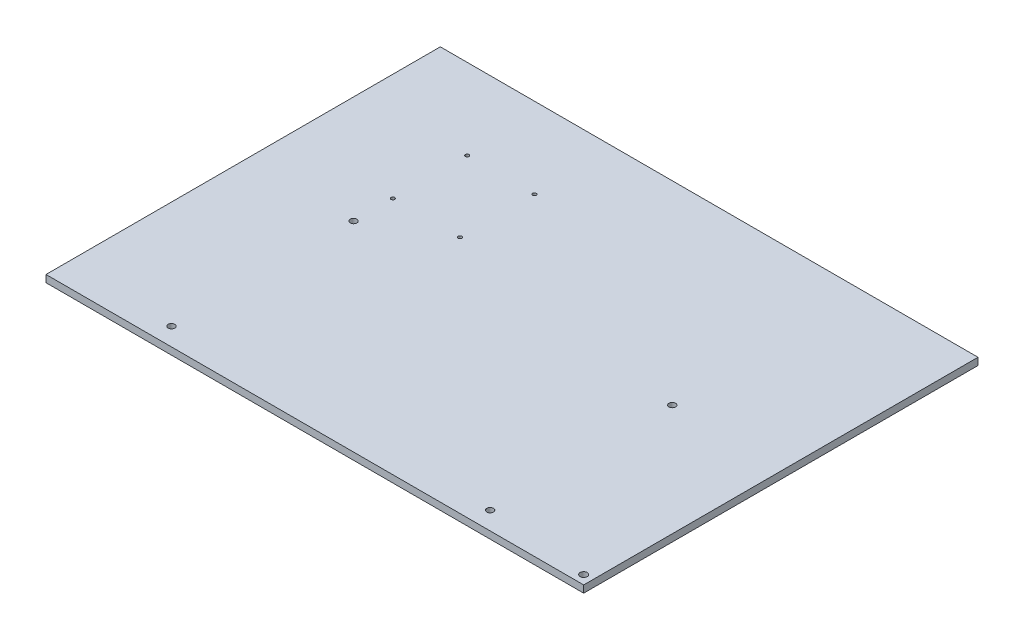
ISO-10303-21;
HEADER;
FILE_DESCRIPTION(('STEP AP214'),'2;1');
FILE_NAME('part.step','',(''),(''),'','','');
FILE_SCHEMA(('AUTOMOTIVE_DESIGN { 1 0 10303 214 1 1 1 1 }'));
ENDSEC;
DATA;
#1=APPLICATION_CONTEXT('core data for automotive mechanical design processes');
#2=APPLICATION_PROTOCOL_DEFINITION('international standard','automotive_design',2000,#1);
#3=PRODUCT_CONTEXT('',#1,'mechanical');
#4=PRODUCT('Part','Part','',(#3));
#5=PRODUCT_RELATED_PRODUCT_CATEGORY('part','',(#4));
#6=PRODUCT_DEFINITION_FORMATION('','',#4);
#7=PRODUCT_DEFINITION_CONTEXT('part definition',#1,'design');
#8=PRODUCT_DEFINITION('design','',#6,#7);
#9=PRODUCT_DEFINITION_SHAPE('','',#8);
#10=(LENGTH_UNIT() NAMED_UNIT(*) SI_UNIT(.MILLI.,.METRE.));
#11=(NAMED_UNIT(*) PLANE_ANGLE_UNIT() SI_UNIT($,.RADIAN.));
#12=(NAMED_UNIT(*) SI_UNIT($,.STERADIAN.) SOLID_ANGLE_UNIT());
#13=UNCERTAINTY_MEASURE_WITH_UNIT(LENGTH_MEASURE(1.E-05),#10,'distance_accuracy_value','');
#14=(GEOMETRIC_REPRESENTATION_CONTEXT(3) GLOBAL_UNCERTAINTY_ASSIGNED_CONTEXT((#13)) GLOBAL_UNIT_ASSIGNED_CONTEXT((#10,
#11,#12)) REPRESENTATION_CONTEXT('',''));
#15=CARTESIAN_POINT('',(0.,0.,0.));
#16=DIRECTION('',(0.,0.,1.));
#17=DIRECTION('',(1.,0.,0.));
#18=AXIS2_PLACEMENT_3D('',#15,#16,#17);
#19=CARTESIAN_POINT('',(-150.,4.,110.));
#20=DIRECTION('',(1.,0.,0.));
#21=DIRECTION('',(0.,0.,-1.));
#22=AXIS2_PLACEMENT_3D('',#19,#20,#21);
#23=PLANE('',#22);
#24=DIRECTION('',(0.,0.,1.));
#25=VECTOR('',#24,1.);
#26=CARTESIAN_POINT('',(-150.,0.,110.));
#27=LINE('',#26,#25);
#28=CARTESIAN_POINT('',(-150.,0.,-110.));
#29=VERTEX_POINT('',#28);
#30=CARTESIAN_POINT('',(-150.,0.,110.));
#31=VERTEX_POINT('',#30);
#32=EDGE_CURVE('E116',#29,#31,#27,.T.);
#33=ORIENTED_EDGE('',*,*,#32,.T.);
#34=DIRECTION('',(0.,-1.,0.));
#35=VECTOR('',#34,1.);
#36=CARTESIAN_POINT('',(-150.,4.,110.));
#37=LINE('',#36,#35);
#38=CARTESIAN_POINT('',(-150.,4.,110.));
#39=VERTEX_POINT('',#38);
#40=EDGE_CURVE('E11',#39,#31,#37,.T.);
#41=ORIENTED_EDGE('',*,*,#40,.F.);
#42=DIRECTION('',(0.,0.,1.));
#43=VECTOR('',#42,1.);
#44=CARTESIAN_POINT('',(-150.,4.,110.));
#45=LINE('',#44,#43);
#46=CARTESIAN_POINT('',(-150.,4.,-110.));
#47=VERTEX_POINT('',#46);
#48=EDGE_CURVE('E99',#47,#39,#45,.T.);
#49=ORIENTED_EDGE('',*,*,#48,.F.);
#50=DIRECTION('',(0.,-1.,0.));
#51=VECTOR('',#50,1.);
#52=CARTESIAN_POINT('',(-150.,4.,-110.));
#53=LINE('',#52,#51);
#54=EDGE_CURVE('E112',#47,#29,#53,.T.);
#55=ORIENTED_EDGE('',*,*,#54,.T.);
#56=EDGE_LOOP('',(#33,#41,#49,#55));
#57=FACE_BOUND('',#56,.T.);
#58=ADVANCED_FACE('F45',(#57),#23,.F.);
#59=CARTESIAN_POINT('',(150.,4.,110.));
#60=DIRECTION('',(0.,0.,-1.));
#61=DIRECTION('',(-1.,0.,0.));
#62=AXIS2_PLACEMENT_3D('',#59,#60,#61);
#63=PLANE('',#62);
#64=DIRECTION('',(1.,0.,0.));
#65=VECTOR('',#64,1.);
#66=CARTESIAN_POINT('',(150.,0.,110.));
#67=LINE('',#66,#65);
#68=CARTESIAN_POINT('',(150.,0.,110.));
#69=VERTEX_POINT('',#68);
#70=EDGE_CURVE('E104',#31,#69,#67,.T.);
#71=ORIENTED_EDGE('',*,*,#70,.T.);
#72=DIRECTION('',(0.,-1.,0.));
#73=VECTOR('',#72,1.);
#74=CARTESIAN_POINT('',(150.,4.,110.));
#75=LINE('',#74,#73);
#76=CARTESIAN_POINT('',(150.,4.,110.));
#77=VERTEX_POINT('',#76);
#78=EDGE_CURVE('E55',#77,#69,#75,.T.);
#79=ORIENTED_EDGE('',*,*,#78,.F.);
#80=DIRECTION('',(1.,0.,0.));
#81=VECTOR('',#80,1.);
#82=CARTESIAN_POINT('',(150.,4.,110.));
#83=LINE('',#82,#81);
#84=EDGE_CURVE('E94',#39,#77,#83,.T.);
#85=ORIENTED_EDGE('',*,*,#84,.F.);
#86=ORIENTED_EDGE('',*,*,#40,.T.);
#87=EDGE_LOOP('',(#71,#79,#85,#86));
#88=FACE_BOUND('',#87,.T.);
#89=ADVANCED_FACE('F103',(#88),#63,.F.);
#90=CARTESIAN_POINT('',(150.,4.,110.));
#91=DIRECTION('',(-1.,0.,0.));
#92=DIRECTION('',(0.,0.,1.));
#93=AXIS2_PLACEMENT_3D('',#90,#91,#92);
#94=PLANE('',#93);
#95=DIRECTION('',(0.,0.,-1.));
#96=VECTOR('',#95,1.);
#97=CARTESIAN_POINT('',(150.,0.,110.));
#98=LINE('',#97,#96);
#99=CARTESIAN_POINT('',(150.,0.,-110.));
#100=VERTEX_POINT('',#99);
#101=EDGE_CURVE('E81',#69,#100,#98,.T.);
#102=ORIENTED_EDGE('',*,*,#101,.T.);
#103=DIRECTION('',(0.,-1.,0.));
#104=VECTOR('',#103,1.);
#105=CARTESIAN_POINT('',(150.,4.,-110.));
#106=LINE('',#105,#104);
#107=CARTESIAN_POINT('',(150.,4.,-110.));
#108=VERTEX_POINT('',#107);
#109=EDGE_CURVE('E106',#108,#100,#106,.T.);
#110=ORIENTED_EDGE('',*,*,#109,.F.);
#111=DIRECTION('',(0.,0.,-1.));
#112=VECTOR('',#111,1.);
#113=CARTESIAN_POINT('',(150.,4.,110.));
#114=LINE('',#113,#112);
#115=EDGE_CURVE('E97',#77,#108,#114,.T.);
#116=ORIENTED_EDGE('',*,*,#115,.F.);
#117=ORIENTED_EDGE('',*,*,#78,.T.);
#118=EDGE_LOOP('',(#102,#110,#116,#117));
#119=FACE_BOUND('',#118,.T.);
#120=ADVANCED_FACE('F108',(#119),#94,.F.);
#121=CARTESIAN_POINT('',(150.,4.,-110.));
#122=DIRECTION('',(0.,0.,1.));
#123=DIRECTION('',(1.,0.,0.));
#124=AXIS2_PLACEMENT_3D('',#121,#122,#123);
#125=PLANE('',#124);
#126=DIRECTION('',(-1.,0.,0.));
#127=VECTOR('',#126,1.);
#128=CARTESIAN_POINT('',(150.,0.,-110.));
#129=LINE('',#128,#127);
#130=EDGE_CURVE('E87',#100,#29,#129,.T.);
#131=ORIENTED_EDGE('',*,*,#130,.T.);
#132=ORIENTED_EDGE('',*,*,#54,.F.);
#133=DIRECTION('',(-1.,0.,0.));
#134=VECTOR('',#133,1.);
#135=CARTESIAN_POINT('',(150.,4.,-110.));
#136=LINE('',#135,#134);
#137=EDGE_CURVE('E64',#108,#47,#136,.T.);
#138=ORIENTED_EDGE('',*,*,#137,.F.);
#139=ORIENTED_EDGE('',*,*,#109,.T.);
#140=EDGE_LOOP('',(#131,#132,#138,#139));
#141=FACE_BOUND('',#140,.T.);
#142=ADVANCED_FACE('F184',(#141),#125,.F.);
#143=CARTESIAN_POINT('',(0.,4.,0.));
#144=DIRECTION('',(0.,1.,0.));
#145=DIRECTION('',(0.,0.,1.));
#146=AXIS2_PLACEMENT_3D('',#143,#144,#145);
#147=PLANE('',#146);
#148=CARTESIAN_POINT('',(145.,4.,105.));
#149=DIRECTION('',(0.,1.,0.));
#150=DIRECTION('',(0.,0.,1.));
#151=AXIS2_PLACEMENT_3D('',#148,#149,#150);
#152=CIRCLE('',#151,2.);
#153=CARTESIAN_POINT('',(145.,4.,107.));
#154=VERTEX_POINT('',#153);
#155=EDGE_CURVE('E278',#154,#154,#152,.T.);
#156=ORIENTED_EDGE('',*,*,#155,.F.);
#157=EDGE_LOOP('',(#156));
#158=FACE_BOUND('',#157,.T.);
#159=CARTESIAN_POINT('',(-89.9999999999999,4.,-23.5));
#160=DIRECTION('',(0.,1.,0.));
#161=DIRECTION('',(0.,0.,1.));
#162=AXIS2_PLACEMENT_3D('',#159,#160,#161);
#163=CIRCLE('',#162,0.999999999999998);
#164=CARTESIAN_POINT('',(-89.9999999999999,4.,-22.5));
#165=VERTEX_POINT('',#164);
#166=EDGE_CURVE('E312',#165,#165,#163,.T.);
#167=ORIENTED_EDGE('',*,*,#166,.F.);
#168=EDGE_LOOP('',(#167));
#169=FACE_BOUND('',#168,.T.);
#170=CARTESIAN_POINT('',(-52.5,4.,-23.5));
#171=DIRECTION('',(0.,1.,0.));
#172=DIRECTION('',(0.,0.,1.));
#173=AXIS2_PLACEMENT_3D('',#170,#171,#172);
#174=CIRCLE('',#173,0.999999999999998);
#175=CARTESIAN_POINT('',(-52.5,4.,-22.5));
#176=VERTEX_POINT('',#175);
#177=EDGE_CURVE('E308',#176,#176,#174,.T.);
#178=ORIENTED_EDGE('',*,*,#177,.F.);
#179=EDGE_LOOP('',(#178));
#180=FACE_BOUND('',#179,.T.);
#181=CARTESIAN_POINT('',(-52.5,4.,-65.));
#182=DIRECTION('',(0.,1.,0.));
#183=DIRECTION('',(0.,0.,1.));
#184=AXIS2_PLACEMENT_3D('',#181,#182,#183);
#185=CIRCLE('',#184,0.999999999999998);
#186=CARTESIAN_POINT('',(-52.5,4.,-64.));
#187=VERTEX_POINT('',#186);
#188=EDGE_CURVE('E304',#187,#187,#185,.T.);
#189=ORIENTED_EDGE('',*,*,#188,.F.);
#190=EDGE_LOOP('',(#189));
#191=FACE_BOUND('',#190,.T.);
#192=CARTESIAN_POINT('',(-90.,4.,-65.));
#193=DIRECTION('',(0.,1.,0.));
#194=DIRECTION('',(0.,0.,1.));
#195=AXIS2_PLACEMENT_3D('',#192,#193,#194);
#196=CIRCLE('',#195,1.00000000000001);
#197=CARTESIAN_POINT('',(-90.,4.,-64.));
#198=VERTEX_POINT('',#197);
#199=EDGE_CURVE('E300',#198,#198,#196,.T.);
#200=ORIENTED_EDGE('',*,*,#199,.F.);
#201=EDGE_LOOP('',(#200));
#202=FACE_BOUND('',#201,.T.);
#203=CARTESIAN_POINT('',(-89.9999999999999,4.,-1.59999999999996));
#204=DIRECTION('',(0.,1.,0.));
#205=DIRECTION('',(0.,0.,-1.));
#206=AXIS2_PLACEMENT_3D('',#203,#204,#205);
#207=CIRCLE('',#206,1.85);
#208=CARTESIAN_POINT('',(-89.9999999999999,4.,0.250000000000042));
#209=VERTEX_POINT('',#208);
#210=EDGE_CURVE('E316',#209,#209,#207,.T.);
#211=ORIENTED_EDGE('',*,*,#210,.F.);
#212=EDGE_LOOP('',(#211));
#213=FACE_BOUND('',#212,.T.);
#214=CARTESIAN_POINT('',(87.8,4.,-1.59999999999996));
#215=DIRECTION('',(0.,1.,0.));
#216=DIRECTION('',(0.,0.,-1.));
#217=AXIS2_PLACEMENT_3D('',#214,#215,#216);
#218=CIRCLE('',#217,1.85);
#219=CARTESIAN_POINT('',(87.8,4.,0.250000000000042));
#220=VERTEX_POINT('',#219);
#221=EDGE_CURVE('E321',#220,#220,#218,.T.);
#222=ORIENTED_EDGE('',*,*,#221,.F.);
#223=EDGE_LOOP('',(#222));
#224=FACE_BOUND('',#223,.T.);
#225=CARTESIAN_POINT('',(87.8000000000001,4.,100.));
#226=DIRECTION('',(0.,1.,0.));
#227=DIRECTION('',(0.,0.,1.));
#228=AXIS2_PLACEMENT_3D('',#225,#226,#227);
#229=CIRCLE('',#228,1.85000000000001);
#230=CARTESIAN_POINT('',(87.8000000000001,4.,101.85));
#231=VERTEX_POINT('',#230);
#232=EDGE_CURVE('E317',#231,#231,#229,.T.);
#233=ORIENTED_EDGE('',*,*,#232,.F.);
#234=EDGE_LOOP('',(#233));
#235=FACE_BOUND('',#234,.T.);
#236=CARTESIAN_POINT('',(-89.9999999999999,4.,100.));
#237=DIRECTION('',(0.,1.,0.));
#238=DIRECTION('',(0.,0.,1.));
#239=AXIS2_PLACEMENT_3D('',#236,#237,#238);
#240=CIRCLE('',#239,1.85000000000001);
#241=CARTESIAN_POINT('',(-89.9999999999999,4.,101.85));
#242=VERTEX_POINT('',#241);
#243=EDGE_CURVE('E135',#242,#242,#240,.T.);
#244=ORIENTED_EDGE('',*,*,#243,.F.);
#245=EDGE_LOOP('',(#244));
#246=FACE_BOUND('',#245,.T.);
#247=ORIENTED_EDGE('',*,*,#48,.T.);
#248=ORIENTED_EDGE('',*,*,#84,.T.);
#249=ORIENTED_EDGE('',*,*,#115,.T.);
#250=ORIENTED_EDGE('',*,*,#137,.T.);
#251=EDGE_LOOP('',(#247,#248,#249,#250));
#252=FACE_BOUND('',#251,.T.);
#253=ADVANCED_FACE('F95',(#158,#169,#180,#191,#202,#213,#224,#235,#246,#252),#147,.T.);
#254=CARTESIAN_POINT('',(0.,0.,0.));
#255=DIRECTION('',(0.,1.,0.));
#256=DIRECTION('',(0.,0.,1.));
#257=AXIS2_PLACEMENT_3D('',#254,#255,#256);
#258=PLANE('',#257);
#259=CARTESIAN_POINT('',(145.,0.,105.));
#260=DIRECTION('',(0.,1.,0.));
#261=DIRECTION('',(0.,0.,1.));
#262=AXIS2_PLACEMENT_3D('',#259,#260,#261);
#263=CIRCLE('',#262,2.);
#264=CARTESIAN_POINT('',(145.,0.,107.));
#265=VERTEX_POINT('',#264);
#266=EDGE_CURVE('E275',#265,#265,#263,.T.);
#267=ORIENTED_EDGE('',*,*,#266,.T.);
#268=EDGE_LOOP('',(#267));
#269=FACE_BOUND('',#268,.T.);
#270=CARTESIAN_POINT('',(-89.9999999999999,0.,-23.5));
#271=DIRECTION('',(0.,1.,0.));
#272=DIRECTION('',(0.,0.,-1.));
#273=AXIS2_PLACEMENT_3D('',#270,#271,#272);
#274=CIRCLE('',#273,0.999999999999998);
#275=CARTESIAN_POINT('',(-89.9999999999999,0.,-24.5));
#276=VERTEX_POINT('',#275);
#277=EDGE_CURVE('E282',#276,#276,#274,.T.);
#278=ORIENTED_EDGE('',*,*,#277,.T.);
#279=EDGE_LOOP('',(#278));
#280=FACE_BOUND('',#279,.T.);
#281=CARTESIAN_POINT('',(-52.5,0.,-23.5));
#282=DIRECTION('',(0.,1.,0.));
#283=DIRECTION('',(0.,0.,1.));
#284=AXIS2_PLACEMENT_3D('',#281,#282,#283);
#285=CIRCLE('',#284,0.999999999999998);
#286=CARTESIAN_POINT('',(-52.5,0.,-22.5));
#287=VERTEX_POINT('',#286);
#288=EDGE_CURVE('E290',#287,#287,#285,.T.);
#289=ORIENTED_EDGE('',*,*,#288,.T.);
#290=EDGE_LOOP('',(#289));
#291=FACE_BOUND('',#290,.T.);
#292=CARTESIAN_POINT('',(-52.5,0.,-65.));
#293=DIRECTION('',(0.,1.,0.));
#294=DIRECTION('',(0.,0.,-1.));
#295=AXIS2_PLACEMENT_3D('',#292,#293,#294);
#296=CIRCLE('',#295,0.999999999999998);
#297=CARTESIAN_POINT('',(-52.5,0.,-66.));
#298=VERTEX_POINT('',#297);
#299=EDGE_CURVE('E285',#298,#298,#296,.T.);
#300=ORIENTED_EDGE('',*,*,#299,.T.);
#301=EDGE_LOOP('',(#300));
#302=FACE_BOUND('',#301,.T.);
#303=CARTESIAN_POINT('',(-90.,0.,-65.));
#304=DIRECTION('',(0.,1.,0.));
#305=DIRECTION('',(0.,0.,1.));
#306=AXIS2_PLACEMENT_3D('',#303,#304,#305);
#307=CIRCLE('',#306,1.00000000000001);
#308=CARTESIAN_POINT('',(-90.,0.,-64.));
#309=VERTEX_POINT('',#308);
#310=EDGE_CURVE('E289',#309,#309,#307,.T.);
#311=ORIENTED_EDGE('',*,*,#310,.T.);
#312=EDGE_LOOP('',(#311));
#313=FACE_BOUND('',#312,.T.);
#314=CARTESIAN_POINT('',(-89.9999999999999,0.,-1.59999999999996));
#315=DIRECTION('',(0.,1.,0.));
#316=DIRECTION('',(0.,0.,1.));
#317=AXIS2_PLACEMENT_3D('',#314,#315,#316);
#318=CIRCLE('',#317,1.85);
#319=CARTESIAN_POINT('',(-89.9999999999999,0.,0.250000000000042));
#320=VERTEX_POINT('',#319);
#321=EDGE_CURVE('E48',#320,#320,#318,.T.);
#322=ORIENTED_EDGE('',*,*,#321,.T.);
#323=EDGE_LOOP('',(#322));
#324=FACE_BOUND('',#323,.T.);
#325=CARTESIAN_POINT('',(87.8,0.,-1.59999999999996));
#326=DIRECTION('',(0.,1.,0.));
#327=DIRECTION('',(0.,0.,1.));
#328=AXIS2_PLACEMENT_3D('',#325,#326,#327);
#329=CIRCLE('',#328,1.85);
#330=CARTESIAN_POINT('',(87.8,0.,0.250000000000042));
#331=VERTEX_POINT('',#330);
#332=EDGE_CURVE('E138',#331,#331,#329,.T.);
#333=ORIENTED_EDGE('',*,*,#332,.T.);
#334=EDGE_LOOP('',(#333));
#335=FACE_BOUND('',#334,.T.);
#336=CARTESIAN_POINT('',(87.8000000000001,0.,100.));
#337=DIRECTION('',(0.,1.,0.));
#338=DIRECTION('',(0.,0.,1.));
#339=AXIS2_PLACEMENT_3D('',#336,#337,#338);
#340=CIRCLE('',#339,1.85000000000001);
#341=CARTESIAN_POINT('',(87.8000000000001,0.,101.85));
#342=VERTEX_POINT('',#341);
#343=EDGE_CURVE('E134',#342,#342,#340,.T.);
#344=ORIENTED_EDGE('',*,*,#343,.T.);
#345=EDGE_LOOP('',(#344));
#346=FACE_BOUND('',#345,.T.);
#347=CARTESIAN_POINT('',(-89.9999999999999,0.,100.));
#348=DIRECTION('',(0.,1.,0.));
#349=DIRECTION('',(0.,0.,1.));
#350=AXIS2_PLACEMENT_3D('',#347,#348,#349);
#351=CIRCLE('',#350,1.85000000000001);
#352=CARTESIAN_POINT('',(-89.9999999999999,0.,101.85));
#353=VERTEX_POINT('',#352);
#354=EDGE_CURVE('E130',#353,#353,#351,.T.);
#355=ORIENTED_EDGE('',*,*,#354,.T.);
#356=EDGE_LOOP('',(#355));
#357=FACE_BOUND('',#356,.T.);
#358=ORIENTED_EDGE('',*,*,#32,.F.);
#359=ORIENTED_EDGE('',*,*,#130,.F.);
#360=ORIENTED_EDGE('',*,*,#101,.F.);
#361=ORIENTED_EDGE('',*,*,#70,.F.);
#362=EDGE_LOOP('',(#358,#359,#360,#361));
#363=FACE_BOUND('',#362,.T.);
#364=ADVANCED_FACE('F147',(#269,#280,#291,#302,#313,#324,#335,#346,#357,#363),#258,.F.);
#365=CARTESIAN_POINT('',(-89.9999999999999,-1.2E-05,100.));
#366=DIRECTION('',(0.,1.,0.));
#367=DIRECTION('',(0.,0.,1.));
#368=AXIS2_PLACEMENT_3D('',#365,#366,#367);
#369=CYLINDRICAL_SURFACE('',#368,1.85000000000001);
#370=CARTESIAN_POINT('',(-89.9999999999999,4.,101.85));
#371=CARTESIAN_POINT('',(-89.9999999999999,3.95833333333333,101.85));
#372=CARTESIAN_POINT('',(-89.9999999999999,3.91666666666667,101.85));
#373=CARTESIAN_POINT('',(-89.9999999999999,3.83333333333333,101.85));
#374=CARTESIAN_POINT('',(-89.9999999999999,3.79166666666667,101.85));
#375=CARTESIAN_POINT('',(-89.9999999999999,3.70833333333333,101.85));
#376=CARTESIAN_POINT('',(-89.9999999999999,3.66666666666667,101.85));
#377=CARTESIAN_POINT('',(-89.9999999999999,3.58333333333333,101.85));
#378=CARTESIAN_POINT('',(-89.9999999999999,3.54166666666667,101.85));
#379=CARTESIAN_POINT('',(-89.9999999999999,3.45833333333333,101.85));
#380=CARTESIAN_POINT('',(-89.9999999999999,3.41666666666667,101.85));
#381=CARTESIAN_POINT('',(-89.9999999999999,3.33333333333333,101.85));
#382=CARTESIAN_POINT('',(-89.9999999999999,3.29166666666667,101.85));
#383=CARTESIAN_POINT('',(-89.9999999999999,3.20833333333333,101.85));
#384=CARTESIAN_POINT('',(-89.9999999999999,3.16666666666667,101.85));
#385=CARTESIAN_POINT('',(-89.9999999999999,3.08333333333333,101.85));
#386=CARTESIAN_POINT('',(-89.9999999999999,3.04166666666667,101.85));
#387=CARTESIAN_POINT('',(-89.9999999999999,2.95833333333333,101.85));
#388=CARTESIAN_POINT('',(-89.9999999999999,2.91666666666667,101.85));
#389=CARTESIAN_POINT('',(-89.9999999999999,2.83333333333333,101.85));
#390=CARTESIAN_POINT('',(-89.9999999999999,2.79166666666667,101.85));
#391=CARTESIAN_POINT('',(-89.9999999999999,2.70833333333333,101.85));
#392=CARTESIAN_POINT('',(-89.9999999999999,2.66666666666667,101.85));
#393=CARTESIAN_POINT('',(-89.9999999999999,2.58333333333333,101.85));
#394=CARTESIAN_POINT('',(-89.9999999999999,2.54166666666667,101.85));
#395=CARTESIAN_POINT('',(-89.9999999999999,2.45833333333333,101.85));
#396=CARTESIAN_POINT('',(-89.9999999999999,2.41666666666667,101.85));
#397=CARTESIAN_POINT('',(-89.9999999999999,2.33333333333333,101.85));
#398=CARTESIAN_POINT('',(-89.9999999999999,2.29166666666667,101.85));
#399=CARTESIAN_POINT('',(-89.9999999999999,2.20833333333333,101.85));
#400=CARTESIAN_POINT('',(-89.9999999999999,2.16666666666667,101.85));
#401=CARTESIAN_POINT('',(-89.9999999999999,2.08333333333333,101.85));
#402=CARTESIAN_POINT('',(-89.9999999999999,2.04166666666667,101.85));
#403=CARTESIAN_POINT('',(-89.9999999999999,1.95833333333333,101.85));
#404=CARTESIAN_POINT('',(-89.9999999999999,1.91666666666667,101.85));
#405=CARTESIAN_POINT('',(-89.9999999999999,1.83333333333333,101.85));
#406=CARTESIAN_POINT('',(-89.9999999999999,1.79166666666667,101.85));
#407=CARTESIAN_POINT('',(-89.9999999999999,1.70833333333333,101.85));
#408=CARTESIAN_POINT('',(-89.9999999999999,1.66666666666667,101.85));
#409=CARTESIAN_POINT('',(-89.9999999999999,1.58333333333333,101.85));
#410=CARTESIAN_POINT('',(-89.9999999999999,1.54166666666667,101.85));
#411=CARTESIAN_POINT('',(-89.9999999999999,1.45833333333333,101.85));
#412=CARTESIAN_POINT('',(-89.9999999999999,1.41666666666667,101.85));
#413=CARTESIAN_POINT('',(-89.9999999999999,1.33333333333333,101.85));
#414=CARTESIAN_POINT('',(-89.9999999999999,1.29166666666667,101.85));
#415=CARTESIAN_POINT('',(-89.9999999999999,1.20833333333333,101.85));
#416=CARTESIAN_POINT('',(-89.9999999999999,1.16666666666667,101.85));
#417=CARTESIAN_POINT('',(-89.9999999999999,1.08333333333333,101.85));
#418=CARTESIAN_POINT('',(-89.9999999999999,1.04166666666667,101.85));
#419=CARTESIAN_POINT('',(-89.9999999999999,0.958333333333333,101.85));
#420=CARTESIAN_POINT('',(-89.9999999999999,0.916666666666667,101.85));
#421=CARTESIAN_POINT('',(-89.9999999999999,0.833333333333333,101.85));
#422=CARTESIAN_POINT('',(-89.9999999999999,0.791666666666667,101.85));
#423=CARTESIAN_POINT('',(-89.9999999999999,0.708333333333333,101.85));
#424=CARTESIAN_POINT('',(-89.9999999999999,0.666666666666667,101.85));
#425=CARTESIAN_POINT('',(-89.9999999999999,0.583333333333333,101.85));
#426=CARTESIAN_POINT('',(-89.9999999999999,0.541666666666666,101.85));
#427=CARTESIAN_POINT('',(-89.9999999999999,0.458333333333333,101.85));
#428=CARTESIAN_POINT('',(-89.9999999999999,0.416666666666666,101.85));
#429=CARTESIAN_POINT('',(-89.9999999999999,0.333333333333333,101.85));
#430=CARTESIAN_POINT('',(-89.9999999999999,0.291666666666666,101.85));
#431=CARTESIAN_POINT('',(-89.9999999999999,0.208333333333333,101.85));
#432=CARTESIAN_POINT('',(-89.9999999999999,0.166666666666667,101.85));
#433=CARTESIAN_POINT('',(-89.9999999999999,0.0833333333333331,101.85));
#434=CARTESIAN_POINT('',(-89.9999999999999,0.0416666666666665,101.85));
#435=CARTESIAN_POINT('',(-89.9999999999999,0.,101.85));
#436=B_SPLINE_CURVE_WITH_KNOTS('',3,(#370,#371,#372,#373,#374,#375,#376,#377,#378,#379,#380,
#381,#382,#383,#384,#385,#386,#387,#388,#389,#390,#391,#392,#393,#394,#395,#396,#397,#398,#399,
#400,#401,#402,#403,#404,#405,#406,#407,#408,#409,#410,#411,#412,#413,#414,#415,#416,#417,#418,
#419,#420,#421,#422,#423,#424,#425,#426,#427,#428,#429,#430,#431,#432,#433,#434,#435),
.UNSPECIFIED.,.F.,.F.,(4,2,2,2,2,2,2,2,2,2,2,2,2,2,2,2,2,2,2,2,2,2,2,2,2,2,2,2,2,2,2,2,4),(0.,
0.125,0.25,0.375,0.5,0.625,0.75,0.875,1.,1.125,1.25,1.375,1.5,1.625,1.75,1.875,2.,2.125,2.25,
2.375,2.5,2.625,2.75,2.875,3.,3.125,3.25,3.375,3.5,3.625,3.75,3.875,4.),.UNSPECIFIED.);
#437=EDGE_CURVE('BSEAM175',#242,#353,#436,.T.);
#438=ORIENTED_EDGE('',*,*,#243,.T.);
#439=ORIENTED_EDGE('',*,*,#354,.F.);
#440=ORIENTED_EDGE('',*,*,#437,.T.);
#441=ORIENTED_EDGE('',*,*,#437,.F.);
#442=EDGE_LOOP('',(#438,#440,#439,#441));
#443=FACE_BOUND('',#442,.T.);
#444=ADVANCED_FACE('F175',(#443),#369,.F.);
#445=CARTESIAN_POINT('',(87.8000000000001,-1.2E-05,100.));
#446=DIRECTION('',(0.,1.,0.));
#447=DIRECTION('',(0.,0.,1.));
#448=AXIS2_PLACEMENT_3D('',#445,#446,#447);
#449=CYLINDRICAL_SURFACE('',#448,1.85000000000001);
#450=CARTESIAN_POINT('',(87.8000000000001,4.,101.85));
#451=CARTESIAN_POINT('',(87.8000000000001,3.95833333333333,101.85));
#452=CARTESIAN_POINT('',(87.8000000000001,3.91666666666667,101.85));
#453=CARTESIAN_POINT('',(87.8000000000001,3.83333333333333,101.85));
#454=CARTESIAN_POINT('',(87.8000000000001,3.79166666666667,101.85));
#455=CARTESIAN_POINT('',(87.8000000000001,3.70833333333333,101.85));
#456=CARTESIAN_POINT('',(87.8000000000001,3.66666666666667,101.85));
#457=CARTESIAN_POINT('',(87.8000000000001,3.58333333333333,101.85));
#458=CARTESIAN_POINT('',(87.8000000000001,3.54166666666667,101.85));
#459=CARTESIAN_POINT('',(87.8000000000001,3.45833333333333,101.85));
#460=CARTESIAN_POINT('',(87.8000000000001,3.41666666666667,101.85));
#461=CARTESIAN_POINT('',(87.8000000000001,3.33333333333333,101.85));
#462=CARTESIAN_POINT('',(87.8000000000001,3.29166666666667,101.85));
#463=CARTESIAN_POINT('',(87.8000000000001,3.20833333333333,101.85));
#464=CARTESIAN_POINT('',(87.8000000000001,3.16666666666667,101.85));
#465=CARTESIAN_POINT('',(87.8000000000001,3.08333333333333,101.85));
#466=CARTESIAN_POINT('',(87.8000000000001,3.04166666666667,101.85));
#467=CARTESIAN_POINT('',(87.8000000000001,2.95833333333333,101.85));
#468=CARTESIAN_POINT('',(87.8000000000001,2.91666666666667,101.85));
#469=CARTESIAN_POINT('',(87.8000000000001,2.83333333333333,101.85));
#470=CARTESIAN_POINT('',(87.8000000000001,2.79166666666667,101.85));
#471=CARTESIAN_POINT('',(87.8000000000001,2.70833333333333,101.85));
#472=CARTESIAN_POINT('',(87.8000000000001,2.66666666666667,101.85));
#473=CARTESIAN_POINT('',(87.8000000000001,2.58333333333333,101.85));
#474=CARTESIAN_POINT('',(87.8000000000001,2.54166666666667,101.85));
#475=CARTESIAN_POINT('',(87.8000000000001,2.45833333333333,101.85));
#476=CARTESIAN_POINT('',(87.8000000000001,2.41666666666667,101.85));
#477=CARTESIAN_POINT('',(87.8000000000001,2.33333333333333,101.85));
#478=CARTESIAN_POINT('',(87.8000000000001,2.29166666666667,101.85));
#479=CARTESIAN_POINT('',(87.8000000000001,2.20833333333333,101.85));
#480=CARTESIAN_POINT('',(87.8000000000001,2.16666666666667,101.85));
#481=CARTESIAN_POINT('',(87.8000000000001,2.08333333333333,101.85));
#482=CARTESIAN_POINT('',(87.8000000000001,2.04166666666667,101.85));
#483=CARTESIAN_POINT('',(87.8000000000001,1.95833333333333,101.85));
#484=CARTESIAN_POINT('',(87.8000000000001,1.91666666666667,101.85));
#485=CARTESIAN_POINT('',(87.8000000000001,1.83333333333333,101.85));
#486=CARTESIAN_POINT('',(87.8000000000001,1.79166666666667,101.85));
#487=CARTESIAN_POINT('',(87.8000000000001,1.70833333333333,101.85));
#488=CARTESIAN_POINT('',(87.8000000000001,1.66666666666667,101.85));
#489=CARTESIAN_POINT('',(87.8000000000001,1.58333333333333,101.85));
#490=CARTESIAN_POINT('',(87.8000000000001,1.54166666666667,101.85));
#491=CARTESIAN_POINT('',(87.8000000000001,1.45833333333333,101.85));
#492=CARTESIAN_POINT('',(87.8000000000001,1.41666666666667,101.85));
#493=CARTESIAN_POINT('',(87.8000000000001,1.33333333333333,101.85));
#494=CARTESIAN_POINT('',(87.8000000000001,1.29166666666667,101.85));
#495=CARTESIAN_POINT('',(87.8000000000001,1.20833333333333,101.85));
#496=CARTESIAN_POINT('',(87.8000000000001,1.16666666666667,101.85));
#497=CARTESIAN_POINT('',(87.8000000000001,1.08333333333333,101.85));
#498=CARTESIAN_POINT('',(87.8000000000001,1.04166666666667,101.85));
#499=CARTESIAN_POINT('',(87.8000000000001,0.958333333333333,101.85));
#500=CARTESIAN_POINT('',(87.8000000000001,0.916666666666667,101.85));
#501=CARTESIAN_POINT('',(87.8000000000001,0.833333333333333,101.85));
#502=CARTESIAN_POINT('',(87.8000000000001,0.791666666666667,101.85));
#503=CARTESIAN_POINT('',(87.8000000000001,0.708333333333333,101.85));
#504=CARTESIAN_POINT('',(87.8000000000001,0.666666666666667,101.85));
#505=CARTESIAN_POINT('',(87.8000000000001,0.583333333333333,101.85));
#506=CARTESIAN_POINT('',(87.8000000000001,0.541666666666666,101.85));
#507=CARTESIAN_POINT('',(87.8000000000001,0.458333333333333,101.85));
#508=CARTESIAN_POINT('',(87.8000000000001,0.416666666666666,101.85));
#509=CARTESIAN_POINT('',(87.8000000000001,0.333333333333333,101.85));
#510=CARTESIAN_POINT('',(87.8000000000001,0.291666666666666,101.85));
#511=CARTESIAN_POINT('',(87.8000000000001,0.208333333333333,101.85));
#512=CARTESIAN_POINT('',(87.8000000000001,0.166666666666667,101.85));
#513=CARTESIAN_POINT('',(87.8000000000001,0.0833333333333331,101.85));
#514=CARTESIAN_POINT('',(87.8000000000001,0.0416666666666665,101.85));
#515=CARTESIAN_POINT('',(87.8000000000001,0.,101.85));
#516=B_SPLINE_CURVE_WITH_KNOTS('',3,(#450,#451,#452,#453,#454,#455,#456,#457,#458,#459,#460,
#461,#462,#463,#464,#465,#466,#467,#468,#469,#470,#471,#472,#473,#474,#475,#476,#477,#478,#479,
#480,#481,#482,#483,#484,#485,#486,#487,#488,#489,#490,#491,#492,#493,#494,#495,#496,#497,#498,
#499,#500,#501,#502,#503,#504,#505,#506,#507,#508,#509,#510,#511,#512,#513,#514,#515),
.UNSPECIFIED.,.F.,.F.,(4,2,2,2,2,2,2,2,2,2,2,2,2,2,2,2,2,2,2,2,2,2,2,2,2,2,2,2,2,2,2,2,4),(0.,
0.125,0.25,0.375,0.5,0.625,0.75,0.875,1.,1.125,1.25,1.375,1.5,1.625,1.75,1.875,2.,2.125,2.25,
2.375,2.5,2.625,2.75,2.875,3.,3.125,3.25,3.375,3.5,3.625,3.75,3.875,4.),.UNSPECIFIED.);
#517=EDGE_CURVE('BSEAM162',#231,#342,#516,.T.);
#518=ORIENTED_EDGE('',*,*,#232,.T.);
#519=ORIENTED_EDGE('',*,*,#343,.F.);
#520=ORIENTED_EDGE('',*,*,#517,.T.);
#521=ORIENTED_EDGE('',*,*,#517,.F.);
#522=EDGE_LOOP('',(#518,#520,#519,#521));
#523=FACE_BOUND('',#522,.T.);
#524=ADVANCED_FACE('F162',(#523),#449,.F.);
#525=CARTESIAN_POINT('',(87.8,-1.2E-05,-1.59999999999996));
#526=DIRECTION('',(0.,1.,0.));
#527=DIRECTION('',(0.,0.,1.));
#528=AXIS2_PLACEMENT_3D('',#525,#526,#527);
#529=CYLINDRICAL_SURFACE('',#528,1.85);
#530=CARTESIAN_POINT('',(87.8,4.,0.250000000000042));
#531=CARTESIAN_POINT('',(87.8,3.95833333333333,0.250000000000042));
#532=CARTESIAN_POINT('',(87.8,3.91666666666667,0.250000000000042));
#533=CARTESIAN_POINT('',(87.8,3.83333333333333,0.250000000000042));
#534=CARTESIAN_POINT('',(87.8,3.79166666666667,0.250000000000042));
#535=CARTESIAN_POINT('',(87.8,3.70833333333333,0.250000000000042));
#536=CARTESIAN_POINT('',(87.8,3.66666666666667,0.250000000000042));
#537=CARTESIAN_POINT('',(87.8,3.58333333333333,0.250000000000042));
#538=CARTESIAN_POINT('',(87.8,3.54166666666667,0.250000000000042));
#539=CARTESIAN_POINT('',(87.8,3.45833333333333,0.250000000000042));
#540=CARTESIAN_POINT('',(87.8,3.41666666666667,0.250000000000042));
#541=CARTESIAN_POINT('',(87.8,3.33333333333333,0.250000000000042));
#542=CARTESIAN_POINT('',(87.8,3.29166666666667,0.250000000000042));
#543=CARTESIAN_POINT('',(87.8,3.20833333333333,0.250000000000042));
#544=CARTESIAN_POINT('',(87.8,3.16666666666667,0.250000000000042));
#545=CARTESIAN_POINT('',(87.8,3.08333333333333,0.250000000000042));
#546=CARTESIAN_POINT('',(87.8,3.04166666666667,0.250000000000042));
#547=CARTESIAN_POINT('',(87.8,2.95833333333333,0.250000000000042));
#548=CARTESIAN_POINT('',(87.8,2.91666666666667,0.250000000000042));
#549=CARTESIAN_POINT('',(87.8,2.83333333333333,0.250000000000042));
#550=CARTESIAN_POINT('',(87.8,2.79166666666667,0.250000000000042));
#551=CARTESIAN_POINT('',(87.8,2.70833333333333,0.250000000000042));
#552=CARTESIAN_POINT('',(87.8,2.66666666666667,0.250000000000042));
#553=CARTESIAN_POINT('',(87.8,2.58333333333333,0.250000000000042));
#554=CARTESIAN_POINT('',(87.8,2.54166666666667,0.250000000000042));
#555=CARTESIAN_POINT('',(87.8,2.45833333333333,0.250000000000042));
#556=CARTESIAN_POINT('',(87.8,2.41666666666667,0.250000000000042));
#557=CARTESIAN_POINT('',(87.8,2.33333333333333,0.250000000000042));
#558=CARTESIAN_POINT('',(87.8,2.29166666666667,0.250000000000042));
#559=CARTESIAN_POINT('',(87.8,2.20833333333333,0.250000000000042));
#560=CARTESIAN_POINT('',(87.8,2.16666666666667,0.250000000000042));
#561=CARTESIAN_POINT('',(87.8,2.08333333333333,0.250000000000042));
#562=CARTESIAN_POINT('',(87.8,2.04166666666667,0.250000000000042));
#563=CARTESIAN_POINT('',(87.8,1.95833333333333,0.250000000000042));
#564=CARTESIAN_POINT('',(87.8,1.91666666666667,0.250000000000042));
#565=CARTESIAN_POINT('',(87.8,1.83333333333333,0.250000000000042));
#566=CARTESIAN_POINT('',(87.8,1.79166666666667,0.250000000000042));
#567=CARTESIAN_POINT('',(87.8,1.70833333333333,0.250000000000042));
#568=CARTESIAN_POINT('',(87.8,1.66666666666667,0.250000000000042));
#569=CARTESIAN_POINT('',(87.8,1.58333333333333,0.250000000000042));
#570=CARTESIAN_POINT('',(87.8,1.54166666666667,0.250000000000042));
#571=CARTESIAN_POINT('',(87.8,1.45833333333333,0.250000000000042));
#572=CARTESIAN_POINT('',(87.8,1.41666666666667,0.250000000000042));
#573=CARTESIAN_POINT('',(87.8,1.33333333333333,0.250000000000042));
#574=CARTESIAN_POINT('',(87.8,1.29166666666667,0.250000000000042));
#575=CARTESIAN_POINT('',(87.8,1.20833333333333,0.250000000000042));
#576=CARTESIAN_POINT('',(87.8,1.16666666666667,0.250000000000042));
#577=CARTESIAN_POINT('',(87.8,1.08333333333333,0.250000000000042));
#578=CARTESIAN_POINT('',(87.8,1.04166666666667,0.250000000000042));
#579=CARTESIAN_POINT('',(87.8,0.958333333333333,0.250000000000042));
#580=CARTESIAN_POINT('',(87.8,0.916666666666667,0.250000000000042));
#581=CARTESIAN_POINT('',(87.8,0.833333333333333,0.250000000000042));
#582=CARTESIAN_POINT('',(87.8,0.791666666666667,0.250000000000042));
#583=CARTESIAN_POINT('',(87.8,0.708333333333333,0.250000000000042));
#584=CARTESIAN_POINT('',(87.8,0.666666666666667,0.250000000000042));
#585=CARTESIAN_POINT('',(87.8,0.583333333333333,0.250000000000042));
#586=CARTESIAN_POINT('',(87.8,0.541666666666666,0.250000000000042));
#587=CARTESIAN_POINT('',(87.8,0.458333333333333,0.250000000000042));
#588=CARTESIAN_POINT('',(87.8,0.416666666666666,0.250000000000042));
#589=CARTESIAN_POINT('',(87.8,0.333333333333333,0.250000000000042));
#590=CARTESIAN_POINT('',(87.8,0.291666666666666,0.250000000000042));
#591=CARTESIAN_POINT('',(87.8,0.208333333333333,0.250000000000042));
#592=CARTESIAN_POINT('',(87.8,0.166666666666667,0.250000000000042));
#593=CARTESIAN_POINT('',(87.8,0.0833333333333331,0.250000000000042));
#594=CARTESIAN_POINT('',(87.8,0.0416666666666665,0.250000000000042));
#595=CARTESIAN_POINT('',(87.8,0.,0.250000000000042));
#596=B_SPLINE_CURVE_WITH_KNOTS('',3,(#530,#531,#532,#533,#534,#535,#536,#537,#538,#539,#540,
#541,#542,#543,#544,#545,#546,#547,#548,#549,#550,#551,#552,#553,#554,#555,#556,#557,#558,#559,
#560,#561,#562,#563,#564,#565,#566,#567,#568,#569,#570,#571,#572,#573,#574,#575,#576,#577,#578,
#579,#580,#581,#582,#583,#584,#585,#586,#587,#588,#589,#590,#591,#592,#593,#594,#595),
.UNSPECIFIED.,.F.,.F.,(4,2,2,2,2,2,2,2,2,2,2,2,2,2,2,2,2,2,2,2,2,2,2,2,2,2,2,2,2,2,2,2,4),(0.,
0.125,0.25,0.375,0.5,0.625,0.75,0.875,1.,1.125,1.25,1.375,1.5,1.625,1.75,1.875,2.,2.125,2.25,
2.375,2.5,2.625,2.75,2.875,3.,3.125,3.25,3.375,3.5,3.625,3.75,3.875,4.),.UNSPECIFIED.);
#597=EDGE_CURVE('BSEAM152',#220,#331,#596,.T.);
#598=ORIENTED_EDGE('',*,*,#221,.T.);
#599=ORIENTED_EDGE('',*,*,#332,.F.);
#600=ORIENTED_EDGE('',*,*,#597,.T.);
#601=ORIENTED_EDGE('',*,*,#597,.F.);
#602=EDGE_LOOP('',(#598,#600,#599,#601));
#603=FACE_BOUND('',#602,.T.);
#604=ADVANCED_FACE('F152',(#603),#529,.F.);
#605=CARTESIAN_POINT('',(-89.9999999999999,-1.2E-05,-1.59999999999996));
#606=DIRECTION('',(0.,1.,0.));
#607=DIRECTION('',(0.,0.,1.));
#608=AXIS2_PLACEMENT_3D('',#605,#606,#607);
#609=CYLINDRICAL_SURFACE('',#608,1.85);
#610=CARTESIAN_POINT('',(-89.9999999999999,4.,0.250000000000042));
#611=CARTESIAN_POINT('',(-89.9999999999999,3.95833333333333,0.250000000000042));
#612=CARTESIAN_POINT('',(-89.9999999999999,3.91666666666667,0.250000000000042));
#613=CARTESIAN_POINT('',(-89.9999999999999,3.83333333333333,0.250000000000042));
#614=CARTESIAN_POINT('',(-89.9999999999999,3.79166666666667,0.250000000000042));
#615=CARTESIAN_POINT('',(-89.9999999999999,3.70833333333333,0.250000000000042));
#616=CARTESIAN_POINT('',(-89.9999999999999,3.66666666666667,0.250000000000042));
#617=CARTESIAN_POINT('',(-89.9999999999999,3.58333333333333,0.250000000000042));
#618=CARTESIAN_POINT('',(-89.9999999999999,3.54166666666667,0.250000000000042));
#619=CARTESIAN_POINT('',(-89.9999999999999,3.45833333333333,0.250000000000042));
#620=CARTESIAN_POINT('',(-89.9999999999999,3.41666666666667,0.250000000000042));
#621=CARTESIAN_POINT('',(-89.9999999999999,3.33333333333333,0.250000000000042));
#622=CARTESIAN_POINT('',(-89.9999999999999,3.29166666666667,0.250000000000042));
#623=CARTESIAN_POINT('',(-89.9999999999999,3.20833333333333,0.250000000000042));
#624=CARTESIAN_POINT('',(-89.9999999999999,3.16666666666667,0.250000000000042));
#625=CARTESIAN_POINT('',(-89.9999999999999,3.08333333333333,0.250000000000042));
#626=CARTESIAN_POINT('',(-89.9999999999999,3.04166666666667,0.250000000000042));
#627=CARTESIAN_POINT('',(-89.9999999999999,2.95833333333333,0.250000000000042));
#628=CARTESIAN_POINT('',(-89.9999999999999,2.91666666666667,0.250000000000042));
#629=CARTESIAN_POINT('',(-89.9999999999999,2.83333333333333,0.250000000000042));
#630=CARTESIAN_POINT('',(-89.9999999999999,2.79166666666667,0.250000000000042));
#631=CARTESIAN_POINT('',(-89.9999999999999,2.70833333333333,0.250000000000042));
#632=CARTESIAN_POINT('',(-89.9999999999999,2.66666666666667,0.250000000000042));
#633=CARTESIAN_POINT('',(-89.9999999999999,2.58333333333333,0.250000000000042));
#634=CARTESIAN_POINT('',(-89.9999999999999,2.54166666666667,0.250000000000042));
#635=CARTESIAN_POINT('',(-89.9999999999999,2.45833333333333,0.250000000000042));
#636=CARTESIAN_POINT('',(-89.9999999999999,2.41666666666667,0.250000000000042));
#637=CARTESIAN_POINT('',(-89.9999999999999,2.33333333333333,0.250000000000042));
#638=CARTESIAN_POINT('',(-89.9999999999999,2.29166666666667,0.250000000000042));
#639=CARTESIAN_POINT('',(-89.9999999999999,2.20833333333333,0.250000000000042));
#640=CARTESIAN_POINT('',(-89.9999999999999,2.16666666666667,0.250000000000042));
#641=CARTESIAN_POINT('',(-89.9999999999999,2.08333333333333,0.250000000000042));
#642=CARTESIAN_POINT('',(-89.9999999999999,2.04166666666667,0.250000000000042));
#643=CARTESIAN_POINT('',(-89.9999999999999,1.95833333333333,0.250000000000042));
#644=CARTESIAN_POINT('',(-89.9999999999999,1.91666666666667,0.250000000000042));
#645=CARTESIAN_POINT('',(-89.9999999999999,1.83333333333333,0.250000000000042));
#646=CARTESIAN_POINT('',(-89.9999999999999,1.79166666666667,0.250000000000042));
#647=CARTESIAN_POINT('',(-89.9999999999999,1.70833333333333,0.250000000000042));
#648=CARTESIAN_POINT('',(-89.9999999999999,1.66666666666667,0.250000000000042));
#649=CARTESIAN_POINT('',(-89.9999999999999,1.58333333333333,0.250000000000042));
#650=CARTESIAN_POINT('',(-89.9999999999999,1.54166666666667,0.250000000000042));
#651=CARTESIAN_POINT('',(-89.9999999999999,1.45833333333333,0.250000000000042));
#652=CARTESIAN_POINT('',(-89.9999999999999,1.41666666666667,0.250000000000042));
#653=CARTESIAN_POINT('',(-89.9999999999999,1.33333333333333,0.250000000000042));
#654=CARTESIAN_POINT('',(-89.9999999999999,1.29166666666667,0.250000000000042));
#655=CARTESIAN_POINT('',(-89.9999999999999,1.20833333333333,0.250000000000042));
#656=CARTESIAN_POINT('',(-89.9999999999999,1.16666666666667,0.250000000000042));
#657=CARTESIAN_POINT('',(-89.9999999999999,1.08333333333333,0.250000000000042));
#658=CARTESIAN_POINT('',(-89.9999999999999,1.04166666666667,0.250000000000042));
#659=CARTESIAN_POINT('',(-89.9999999999999,0.958333333333333,0.250000000000042));
#660=CARTESIAN_POINT('',(-89.9999999999999,0.916666666666667,0.250000000000042));
#661=CARTESIAN_POINT('',(-89.9999999999999,0.833333333333333,0.250000000000042));
#662=CARTESIAN_POINT('',(-89.9999999999999,0.791666666666667,0.250000000000042));
#663=CARTESIAN_POINT('',(-89.9999999999999,0.708333333333333,0.250000000000042));
#664=CARTESIAN_POINT('',(-89.9999999999999,0.666666666666667,0.250000000000042));
#665=CARTESIAN_POINT('',(-89.9999999999999,0.583333333333333,0.250000000000042));
#666=CARTESIAN_POINT('',(-89.9999999999999,0.541666666666666,0.250000000000042));
#667=CARTESIAN_POINT('',(-89.9999999999999,0.458333333333333,0.250000000000042));
#668=CARTESIAN_POINT('',(-89.9999999999999,0.416666666666666,0.250000000000042));
#669=CARTESIAN_POINT('',(-89.9999999999999,0.333333333333333,0.250000000000042));
#670=CARTESIAN_POINT('',(-89.9999999999999,0.291666666666666,0.250000000000042));
#671=CARTESIAN_POINT('',(-89.9999999999999,0.208333333333333,0.250000000000042));
#672=CARTESIAN_POINT('',(-89.9999999999999,0.166666666666667,0.250000000000042));
#673=CARTESIAN_POINT('',(-89.9999999999999,0.0833333333333331,0.250000000000042));
#674=CARTESIAN_POINT('',(-89.9999999999999,0.0416666666666665,0.250000000000042));
#675=CARTESIAN_POINT('',(-89.9999999999999,0.,0.250000000000042));
#676=B_SPLINE_CURVE_WITH_KNOTS('',3,(#610,#611,#612,#613,#614,#615,#616,#617,#618,#619,#620,
#621,#622,#623,#624,#625,#626,#627,#628,#629,#630,#631,#632,#633,#634,#635,#636,#637,#638,#639,
#640,#641,#642,#643,#644,#645,#646,#647,#648,#649,#650,#651,#652,#653,#654,#655,#656,#657,#658,
#659,#660,#661,#662,#663,#664,#665,#666,#667,#668,#669,#670,#671,#672,#673,#674,#675),
.UNSPECIFIED.,.F.,.F.,(4,2,2,2,2,2,2,2,2,2,2,2,2,2,2,2,2,2,2,2,2,2,2,2,2,2,2,2,2,2,2,2,4),(0.,
0.125,0.25,0.375,0.5,0.625,0.75,0.875,1.,1.125,1.25,1.375,1.5,1.625,1.75,1.875,2.,2.125,2.25,
2.375,2.5,2.625,2.75,2.875,3.,3.125,3.25,3.375,3.5,3.625,3.75,3.875,4.),.UNSPECIFIED.);
#677=EDGE_CURVE('BSEAM149',#209,#320,#676,.T.);
#678=ORIENTED_EDGE('',*,*,#210,.T.);
#679=ORIENTED_EDGE('',*,*,#321,.F.);
#680=ORIENTED_EDGE('',*,*,#677,.T.);
#681=ORIENTED_EDGE('',*,*,#677,.F.);
#682=EDGE_LOOP('',(#678,#680,#679,#681));
#683=FACE_BOUND('',#682,.T.);
#684=ADVANCED_FACE('F149',(#683),#609,.F.);
#685=CARTESIAN_POINT('',(-90.,0.,-65.));
#686=DIRECTION('',(0.,1.,0.));
#687=DIRECTION('',(0.,0.,1.));
#688=AXIS2_PLACEMENT_3D('',#685,#686,#687);
#689=CYLINDRICAL_SURFACE('',#688,1.00000000000001);
#690=ORIENTED_EDGE('',*,*,#199,.T.);
#691=EDGE_LOOP('',(#690));
#692=FACE_BOUND('',#691,.T.);
#693=ORIENTED_EDGE('',*,*,#310,.F.);
#694=EDGE_LOOP('',(#693));
#695=FACE_BOUND('',#694,.T.);
#696=ADVANCED_FACE('F151',(#692,#695),#689,.F.);
#697=CARTESIAN_POINT('',(-52.5,0.,-65.));
#698=DIRECTION('',(0.,1.,0.));
#699=DIRECTION('',(0.,0.,1.));
#700=AXIS2_PLACEMENT_3D('',#697,#698,#699);
#701=CYLINDRICAL_SURFACE('',#700,0.999999999999998);
#702=ORIENTED_EDGE('',*,*,#188,.T.);
#703=EDGE_LOOP('',(#702));
#704=FACE_BOUND('',#703,.T.);
#705=ORIENTED_EDGE('',*,*,#299,.F.);
#706=EDGE_LOOP('',(#705));
#707=FACE_BOUND('',#706,.T.);
#708=ADVANCED_FACE('F159',(#704,#707),#701,.F.);
#709=CARTESIAN_POINT('',(-52.5,0.,-23.5));
#710=DIRECTION('',(0.,1.,0.));
#711=DIRECTION('',(0.,0.,1.));
#712=AXIS2_PLACEMENT_3D('',#709,#710,#711);
#713=CYLINDRICAL_SURFACE('',#712,0.999999999999998);
#714=ORIENTED_EDGE('',*,*,#177,.T.);
#715=EDGE_LOOP('',(#714));
#716=FACE_BOUND('',#715,.T.);
#717=ORIENTED_EDGE('',*,*,#288,.F.);
#718=EDGE_LOOP('',(#717));
#719=FACE_BOUND('',#718,.T.);
#720=ADVANCED_FACE('F241',(#716,#719),#713,.F.);
#721=CARTESIAN_POINT('',(-89.9999999999999,0.,-23.5));
#722=DIRECTION('',(0.,1.,0.));
#723=DIRECTION('',(0.,0.,1.));
#724=AXIS2_PLACEMENT_3D('',#721,#722,#723);
#725=CYLINDRICAL_SURFACE('',#724,0.999999999999998);
#726=ORIENTED_EDGE('',*,*,#166,.T.);
#727=EDGE_LOOP('',(#726));
#728=FACE_BOUND('',#727,.T.);
#729=ORIENTED_EDGE('',*,*,#277,.F.);
#730=EDGE_LOOP('',(#729));
#731=FACE_BOUND('',#730,.T.);
#732=ADVANCED_FACE('F251',(#728,#731),#725,.F.);
#733=CARTESIAN_POINT('',(145.,0.,105.));
#734=DIRECTION('',(0.,1.,0.));
#735=DIRECTION('',(0.,0.,1.));
#736=AXIS2_PLACEMENT_3D('',#733,#734,#735);
#737=CYLINDRICAL_SURFACE('',#736,2.);
#738=ORIENTED_EDGE('',*,*,#266,.F.);
#739=EDGE_LOOP('',(#738));
#740=FACE_BOUND('',#739,.T.);
#741=ORIENTED_EDGE('',*,*,#155,.T.);
#742=EDGE_LOOP('',(#741));
#743=FACE_BOUND('',#742,.T.);
#744=ADVANCED_FACE('F261',(#740,#743),#737,.F.);
#745=CLOSED_SHELL('',(#58,#89,#120,#142,#253,#364,#444,#524,#604,#684,#696,#708,#720,#732,#744));
#746=MANIFOLD_SOLID_BREP('B2',#745);
#747=ADVANCED_BREP_SHAPE_REPRESENTATION('',(#18,#746),#14);
#748=SHAPE_DEFINITION_REPRESENTATION(#9,#747);
ENDSEC;
END-ISO-10303-21;
